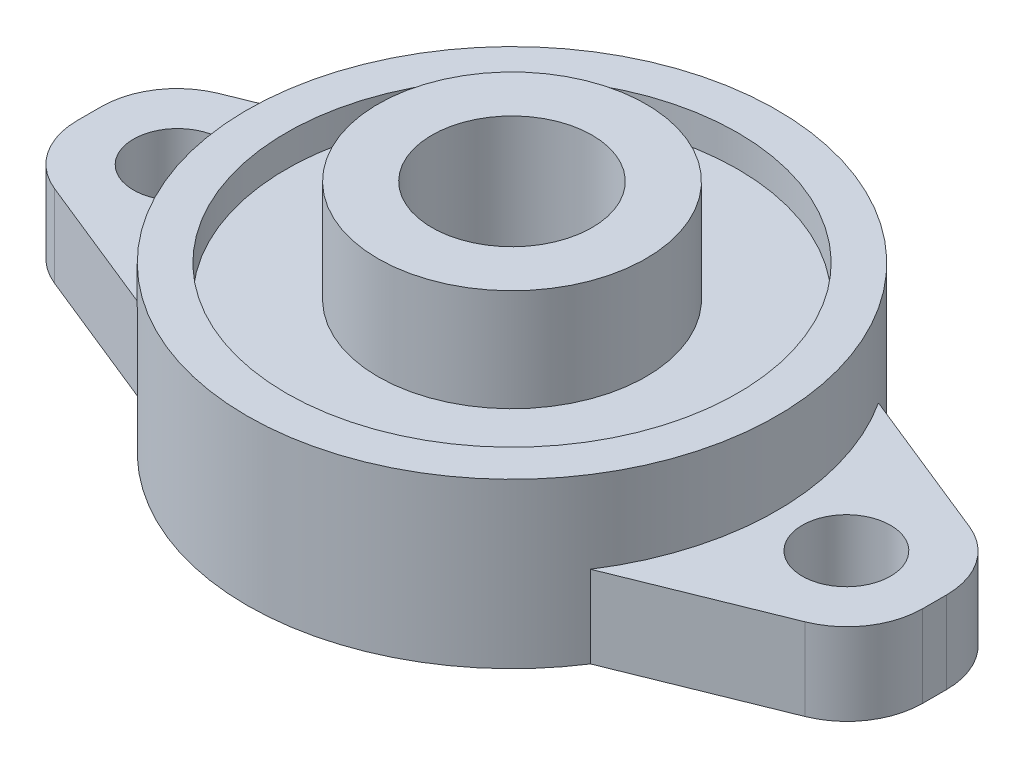
ISO-10303-21;
HEADER;
FILE_DESCRIPTION(('STEP AP214'),'2;1');
FILE_NAME('part.step','',(''),(''),'','','');
FILE_SCHEMA(('AUTOMOTIVE_DESIGN { 1 0 10303 214 1 1 1 1 }'));
ENDSEC;
DATA;
#1=APPLICATION_CONTEXT('core data for automotive mechanical design processes');
#2=APPLICATION_PROTOCOL_DEFINITION('international standard','automotive_design',2000,#1);
#3=PRODUCT_CONTEXT('',#1,'mechanical');
#4=PRODUCT('Part','Part','',(#3));
#5=PRODUCT_RELATED_PRODUCT_CATEGORY('part','',(#4));
#6=PRODUCT_DEFINITION_FORMATION('','',#4);
#7=PRODUCT_DEFINITION_CONTEXT('part definition',#1,'design');
#8=PRODUCT_DEFINITION('design','',#6,#7);
#9=PRODUCT_DEFINITION_SHAPE('','',#8);
#10=(LENGTH_UNIT() NAMED_UNIT(*) SI_UNIT(.MILLI.,.METRE.));
#11=(NAMED_UNIT(*) PLANE_ANGLE_UNIT() SI_UNIT($,.RADIAN.));
#12=(NAMED_UNIT(*) SI_UNIT($,.STERADIAN.) SOLID_ANGLE_UNIT());
#13=UNCERTAINTY_MEASURE_WITH_UNIT(LENGTH_MEASURE(1.E-05),#10,'distance_accuracy_value','');
#14=(GEOMETRIC_REPRESENTATION_CONTEXT(3) GLOBAL_UNCERTAINTY_ASSIGNED_CONTEXT((#13)) GLOBAL_UNIT_ASSIGNED_CONTEXT((#10,
#11,#12)) REPRESENTATION_CONTEXT('',''));
#15=CARTESIAN_POINT('',(0.,0.,0.));
#16=DIRECTION('',(0.,0.,1.));
#17=DIRECTION('',(1.,0.,0.));
#18=AXIS2_PLACEMENT_3D('',#15,#16,#17);
#19=CARTESIAN_POINT('',(0.,6.5,0.));
#20=DIRECTION('',(0.,1.,0.));
#21=DIRECTION('',(0.,0.,1.));
#22=AXIS2_PLACEMENT_3D('',#19,#20,#21);
#23=PLANE('',#22);
#24=DIRECTION('',(-0.927183854566787,0.,0.374606593415913));
#25=VECTOR('',#24,1.);
#26=CARTESIAN_POINT('',(6.43770427047511,6.5,15.9338772060349));
#27=LINE('',#26,#25);
#28=CARTESIAN_POINT('',(29.7476395604955,6.5,6.51605202634617));
#29=VERTEX_POINT('',#28);
#30=CARTESIAN_POINT('',(17.6293978961643,6.5,11.4121394697443));
#31=VERTEX_POINT('',#30);
#32=EDGE_CURVE('E123',#29,#31,#27,.T.);
#33=ORIENTED_EDGE('',*,*,#32,.F.);
#34=CARTESIAN_POINT('',(27.5,6.5,0.952948898945447));
#35=DIRECTION('',(0.,1.,0.));
#36=DIRECTION('',(0.,0.,1.));
#37=AXIS2_PLACEMENT_3D('',#34,#35,#36);
#38=CIRCLE('',#37,6.);
#39=CARTESIAN_POINT('',(33.5,6.5,0.952948898945447));
#40=VERTEX_POINT('',#39);
#41=EDGE_CURVE('E212',#29,#40,#38,.T.);
#42=ORIENTED_EDGE('',*,*,#41,.T.);
#43=DIRECTION('',(0.,0.,1.));
#44=VECTOR('',#43,1.);
#45=CARTESIAN_POINT('',(33.5,6.5,0.));
#46=LINE('',#45,#44);
#47=CARTESIAN_POINT('',(33.5,6.5,-0.952948898945441));
#48=VERTEX_POINT('',#47);
#49=EDGE_CURVE('E134',#48,#40,#46,.T.);
#50=ORIENTED_EDGE('',*,*,#49,.F.);
#51=CARTESIAN_POINT('',(27.5,6.5,-0.952948898945441));
#52=DIRECTION('',(0.,1.,0.));
#53=DIRECTION('',(0.,0.,1.));
#54=AXIS2_PLACEMENT_3D('',#51,#52,#53);
#55=CIRCLE('',#54,6.);
#56=CARTESIAN_POINT('',(29.7476395604955,6.5,-6.51605202634616));
#57=VERTEX_POINT('',#56);
#58=EDGE_CURVE('E211',#48,#57,#55,.T.);
#59=ORIENTED_EDGE('',*,*,#58,.T.);
#60=DIRECTION('',(-0.927183854566787,0.,-0.374606593415913));
#61=VECTOR('',#60,1.);
#62=CARTESIAN_POINT('',(6.43770427047513,6.5,-15.9338772060349));
#63=LINE('',#62,#61);
#64=CARTESIAN_POINT('',(17.6293978961643,6.5,-11.4121394697443));
#65=VERTEX_POINT('',#64);
#66=EDGE_CURVE('E152',#57,#65,#63,.T.);
#67=ORIENTED_EDGE('',*,*,#66,.T.);
#68=CARTESIAN_POINT('',(0.,6.5,0.));
#69=DIRECTION('',(0.,1.,0.));
#70=DIRECTION('',(0.,0.,1.));
#71=AXIS2_PLACEMENT_3D('',#68,#69,#70);
#72=CIRCLE('',#71,21.0007761156148);
#73=EDGE_CURVE('E143',#31,#65,#72,.T.);
#74=ORIENTED_EDGE('',*,*,#73,.F.);
#75=EDGE_LOOP('',(#33,#42,#50,#59,#67,#74));
#76=FACE_BOUND('',#75,.T.);
#77=CARTESIAN_POINT('',(26.5,6.5,0.));
#78=DIRECTION('',(0.,1.,0.));
#79=DIRECTION('',(0.,0.,1.));
#80=AXIS2_PLACEMENT_3D('',#77,#78,#79);
#81=CIRCLE('',#80,3.5);
#82=CARTESIAN_POINT('',(26.5,6.5,-3.5));
#83=VERTEX_POINT('',#82);
#84=EDGE_CURVE('E528',#83,#83,#81,.T.);
#85=ORIENTED_EDGE('',*,*,#84,.F.);
#86=EDGE_LOOP('',(#85));
#87=FACE_BOUND('',#86,.T.);
#88=ADVANCED_FACE('F34',(#76,#87),#23,.T.);
#89=CARTESIAN_POINT('',(-6.43770427047511,6.5,15.9338772060349));
#90=DIRECTION('',(0.374606593415913,0.,-0.927183854566787));
#91=DIRECTION('',(-0.927183854566787,0.,-0.374606593415913));
#92=AXIS2_PLACEMENT_3D('',#89,#90,#91);
#93=PLANE('',#92);
#94=DIRECTION('',(0.927183854566787,0.,0.374606593415913));
#95=VECTOR('',#94,1.);
#96=CARTESIAN_POINT('',(-6.43770427047511,6.5,15.9338772060349));
#97=LINE('',#96,#95);
#98=CARTESIAN_POINT('',(-29.7476395604955,6.5,6.51605202634617));
#99=VERTEX_POINT('',#98);
#100=CARTESIAN_POINT('',(-17.6293978961643,6.5,11.4121394697443));
#101=VERTEX_POINT('',#100);
#102=EDGE_CURVE('E135',#99,#101,#97,.T.);
#103=ORIENTED_EDGE('',*,*,#102,.F.);
#104=DIRECTION('',(0.,-1.,0.));
#105=VECTOR('',#104,1.);
#106=CARTESIAN_POINT('',(-29.7476395604955,0.,6.51605202634617));
#107=LINE('',#106,#105);
#108=CARTESIAN_POINT('',(-29.7476395604955,0.,6.51605202634617));
#109=VERTEX_POINT('',#108);
#110=EDGE_CURVE('E188',#99,#109,#107,.T.);
#111=ORIENTED_EDGE('',*,*,#110,.T.);
#112=DIRECTION('',(0.927183854566787,0.,0.374606593415913));
#113=VECTOR('',#112,1.);
#114=CARTESIAN_POINT('',(-6.43770427047511,0.,15.9338772060349));
#115=LINE('',#114,#113);
#116=CARTESIAN_POINT('',(-17.6293978961643,0.,11.4121394697443));
#117=VERTEX_POINT('',#116);
#118=EDGE_CURVE('E158',#109,#117,#115,.T.);
#119=ORIENTED_EDGE('',*,*,#118,.T.);
#120=DIRECTION('',(0.,-1.,0.));
#121=VECTOR('',#120,1.);
#122=CARTESIAN_POINT('',(-17.6293978961643,6.5,11.4121394697443));
#123=LINE('',#122,#121);
#124=EDGE_CURVE('E147',#101,#117,#123,.T.);
#125=ORIENTED_EDGE('',*,*,#124,.F.);
#126=EDGE_LOOP('',(#103,#111,#119,#125));
#127=FACE_BOUND('',#126,.T.);
#128=ADVANCED_FACE('F271',(#127),#93,.F.);
#129=CARTESIAN_POINT('',(6.43770427047511,6.5,15.9338772060349));
#130=DIRECTION('',(0.374606593415913,0.,0.927183854566787));
#131=DIRECTION('',(0.927183854566787,0.,-0.374606593415913));
#132=AXIS2_PLACEMENT_3D('',#129,#130,#131);
#133=PLANE('',#132);
#134=DIRECTION('',(-0.927183854566787,0.,0.374606593415913));
#135=VECTOR('',#134,1.);
#136=CARTESIAN_POINT('',(6.43770427047511,0.,15.9338772060349));
#137=LINE('',#136,#135);
#138=CARTESIAN_POINT('',(29.7476395604955,0.,6.51605202634617));
#139=VERTEX_POINT('',#138);
#140=CARTESIAN_POINT('',(17.6293978961643,0.,11.4121394697443));
#141=VERTEX_POINT('',#140);
#142=EDGE_CURVE('E235',#139,#141,#137,.T.);
#143=ORIENTED_EDGE('',*,*,#142,.F.);
#144=DIRECTION('',(0.,-1.,0.));
#145=VECTOR('',#144,1.);
#146=CARTESIAN_POINT('',(29.7476395604955,6.5,6.51605202634617));
#147=LINE('',#146,#145);
#148=EDGE_CURVE('E130',#139,#29,#147,.F.);
#149=ORIENTED_EDGE('',*,*,#148,.T.);
#150=ORIENTED_EDGE('',*,*,#32,.T.);
#151=DIRECTION('',(0.,-1.,0.));
#152=VECTOR('',#151,1.);
#153=CARTESIAN_POINT('',(17.6293978961643,6.5,11.4121394697443));
#154=LINE('',#153,#152);
#155=EDGE_CURVE('E127',#31,#141,#154,.T.);
#156=ORIENTED_EDGE('',*,*,#155,.T.);
#157=EDGE_LOOP('',(#143,#149,#150,#156));
#158=FACE_BOUND('',#157,.T.);
#159=ADVANCED_FACE('F126',(#158),#133,.T.);
#160=CARTESIAN_POINT('',(33.5,6.5,0.));
#161=DIRECTION('',(1.,0.,0.));
#162=DIRECTION('',(0.,0.,-1.));
#163=AXIS2_PLACEMENT_3D('',#160,#161,#162);
#164=PLANE('',#163);
#165=ORIENTED_EDGE('',*,*,#49,.T.);
#166=DIRECTION('',(0.,-1.,0.));
#167=VECTOR('',#166,1.);
#168=CARTESIAN_POINT('',(33.5,6.5,0.952948898945447));
#169=LINE('',#168,#167);
#170=CARTESIAN_POINT('',(33.5,0.,0.952948898945447));
#171=VERTEX_POINT('',#170);
#172=EDGE_CURVE('E344',#40,#171,#169,.T.);
#173=ORIENTED_EDGE('',*,*,#172,.T.);
#174=DIRECTION('',(0.,0.,1.));
#175=VECTOR('',#174,1.);
#176=CARTESIAN_POINT('',(33.5,0.,0.));
#177=LINE('',#176,#175);
#178=CARTESIAN_POINT('',(33.5,0.,-0.952948898945441));
#179=VERTEX_POINT('',#178);
#180=EDGE_CURVE('E231',#179,#171,#177,.T.);
#181=ORIENTED_EDGE('',*,*,#180,.F.);
#182=DIRECTION('',(0.,-1.,0.));
#183=VECTOR('',#182,1.);
#184=CARTESIAN_POINT('',(33.5,6.5,-0.952948898945441));
#185=LINE('',#184,#183);
#186=EDGE_CURVE('E350',#179,#48,#185,.F.);
#187=ORIENTED_EDGE('',*,*,#186,.T.);
#188=EDGE_LOOP('',(#165,#173,#181,#187));
#189=FACE_BOUND('',#188,.T.);
#190=ADVANCED_FACE('F304',(#189),#164,.T.);
#191=CARTESIAN_POINT('',(6.43770427047513,6.5,-15.9338772060349));
#192=DIRECTION('',(-0.374606593415913,0.,0.927183854566787));
#193=DIRECTION('',(0.927183854566787,0.,0.374606593415913));
#194=AXIS2_PLACEMENT_3D('',#191,#192,#193);
#195=PLANE('',#194);
#196=ORIENTED_EDGE('',*,*,#66,.F.);
#197=DIRECTION('',(0.,-1.,0.));
#198=VECTOR('',#197,1.);
#199=CARTESIAN_POINT('',(29.7476395604955,0.,-6.51605202634616));
#200=LINE('',#199,#198);
#201=CARTESIAN_POINT('',(29.7476395604955,0.,-6.51605202634616));
#202=VERTEX_POINT('',#201);
#203=EDGE_CURVE('E186',#57,#202,#200,.T.);
#204=ORIENTED_EDGE('',*,*,#203,.T.);
#205=DIRECTION('',(-0.927183854566787,0.,-0.374606593415913));
#206=VECTOR('',#205,1.);
#207=CARTESIAN_POINT('',(6.43770427047513,0.,-15.9338772060349));
#208=LINE('',#207,#206);
#209=CARTESIAN_POINT('',(17.6293978961643,0.,-11.4121394697443));
#210=VERTEX_POINT('',#209);
#211=EDGE_CURVE('E220',#202,#210,#208,.T.);
#212=ORIENTED_EDGE('',*,*,#211,.T.);
#213=DIRECTION('',(0.,-1.,0.));
#214=VECTOR('',#213,1.);
#215=CARTESIAN_POINT('',(17.6293978961643,6.5,-11.4121394697443));
#216=LINE('',#215,#214);
#217=EDGE_CURVE('E148',#65,#210,#216,.T.);
#218=ORIENTED_EDGE('',*,*,#217,.F.);
#219=EDGE_LOOP('',(#196,#204,#212,#218));
#220=FACE_BOUND('',#219,.T.);
#221=ADVANCED_FACE('F219',(#220),#195,.F.);
#222=CARTESIAN_POINT('',(0.,6.5,0.));
#223=DIRECTION('',(0.,-1.,0.));
#224=DIRECTION('',(0.,0.,-1.));
#225=AXIS2_PLACEMENT_3D('',#222,#223,#224);
#226=CYLINDRICAL_SURFACE('',#225,21.0007761156148);
#227=CARTESIAN_POINT('',(0.,0.,0.));
#228=DIRECTION('',(0.,1.,0.));
#229=DIRECTION('',(0.,0.,1.));
#230=AXIS2_PLACEMENT_3D('',#227,#228,#229);
#231=CIRCLE('',#230,21.0007761156148);
#232=CARTESIAN_POINT('',(-17.6293978961643,0.,-11.4121394697443));
#233=VERTEX_POINT('',#232);
#234=EDGE_CURVE('E230',#210,#233,#231,.T.);
#235=ORIENTED_EDGE('',*,*,#234,.T.);
#236=DIRECTION('',(0.,-1.,0.));
#237=VECTOR('',#236,1.);
#238=CARTESIAN_POINT('',(-17.6293978961643,6.5,-11.4121394697443));
#239=LINE('',#238,#237);
#240=CARTESIAN_POINT('',(-17.6293978961643,6.5,-11.4121394697443));
#241=VERTEX_POINT('',#240);
#242=EDGE_CURVE('E336',#241,#233,#239,.T.);
#243=ORIENTED_EDGE('',*,*,#242,.F.);
#244=EDGE_CURVE('E174',#241,#101,#72,.T.);
#245=ORIENTED_EDGE('',*,*,#244,.T.);
#246=ORIENTED_EDGE('',*,*,#124,.T.);
#247=EDGE_CURVE('E146',#117,#141,#231,.T.);
#248=ORIENTED_EDGE('',*,*,#247,.T.);
#249=ORIENTED_EDGE('',*,*,#155,.F.);
#250=ORIENTED_EDGE('',*,*,#73,.T.);
#251=ORIENTED_EDGE('',*,*,#217,.T.);
#252=EDGE_LOOP('',(#235,#243,#245,#246,#248,#249,#250,#251));
#253=FACE_BOUND('',#252,.T.);
#254=CARTESIAN_POINT('',(0.,13.,0.));
#255=DIRECTION('',(0.,1.,0.));
#256=DIRECTION('',(0.,0.,1.));
#257=AXIS2_PLACEMENT_3D('',#254,#255,#256);
#258=CIRCLE('',#257,21.0007761156148);
#259=CARTESIAN_POINT('',(0.,13.,21.0007761156148));
#260=VERTEX_POINT('',#259);
#261=EDGE_CURVE('E154',#260,#260,#258,.T.);
#262=ORIENTED_EDGE('',*,*,#261,.F.);
#263=EDGE_LOOP('',(#262));
#264=FACE_BOUND('',#263,.T.);
#265=ADVANCED_FACE('F140',(#253,#264),#226,.T.);
#266=CARTESIAN_POINT('',(-6.43770427047513,6.5,-15.9338772060349));
#267=DIRECTION('',(-0.374606593415913,0.,-0.927183854566787));
#268=DIRECTION('',(-0.927183854566787,0.,0.374606593415913));
#269=AXIS2_PLACEMENT_3D('',#266,#267,#268);
#270=PLANE('',#269);
#271=DIRECTION('',(0.927183854566787,0.,-0.374606593415913));
#272=VECTOR('',#271,1.);
#273=CARTESIAN_POINT('',(-6.43770427047513,0.,-15.9338772060349));
#274=LINE('',#273,#272);
#275=CARTESIAN_POINT('',(-29.7476395604955,0.,-6.51605202634616));
#276=VERTEX_POINT('',#275);
#277=EDGE_CURVE('E233',#276,#233,#274,.T.);
#278=ORIENTED_EDGE('',*,*,#277,.F.);
#279=DIRECTION('',(0.,-1.,0.));
#280=VECTOR('',#279,1.);
#281=CARTESIAN_POINT('',(-29.7476395604955,6.5,-6.51605202634616));
#282=LINE('',#281,#280);
#283=CARTESIAN_POINT('',(-29.7476395604955,6.5,-6.51605202634616));
#284=VERTEX_POINT('',#283);
#285=EDGE_CURVE('E11',#276,#284,#282,.F.);
#286=ORIENTED_EDGE('',*,*,#285,.T.);
#287=DIRECTION('',(0.927183854566787,0.,-0.374606593415913));
#288=VECTOR('',#287,1.);
#289=CARTESIAN_POINT('',(-6.43770427047513,6.5,-15.9338772060349));
#290=LINE('',#289,#288);
#291=EDGE_CURVE('E196',#284,#241,#290,.T.);
#292=ORIENTED_EDGE('',*,*,#291,.T.);
#293=ORIENTED_EDGE('',*,*,#242,.T.);
#294=EDGE_LOOP('',(#278,#286,#292,#293));
#295=FACE_BOUND('',#294,.T.);
#296=ADVANCED_FACE('F296',(#295),#270,.T.);
#297=CARTESIAN_POINT('',(0.,6.5,0.));
#298=DIRECTION('',(0.,-1.,0.));
#299=DIRECTION('',(0.,0.,-1.));
#300=AXIS2_PLACEMENT_3D('',#297,#298,#299);
#301=CYLINDRICAL_SURFACE('',#300,6.35);
#302=CARTESIAN_POINT('',(0.,0.,0.));
#303=DIRECTION('',(0.,1.,0.));
#304=DIRECTION('',(0.,0.,1.));
#305=AXIS2_PLACEMENT_3D('',#302,#303,#304);
#306=CIRCLE('',#305,6.35);
#307=CARTESIAN_POINT('',(0.,0.,-6.35));
#308=VERTEX_POINT('',#307);
#309=EDGE_CURVE('E245',#308,#308,#306,.T.);
#310=CARTESIAN_POINT('',(0.,18.6,0.));
#311=DIRECTION('',(0.,1.,0.));
#312=DIRECTION('',(0.,0.,1.));
#313=AXIS2_PLACEMENT_3D('',#310,#311,#312);
#314=CIRCLE('',#313,6.35);
#315=CARTESIAN_POINT('',(0.,18.6,-6.35));
#316=VERTEX_POINT('',#315);
#317=EDGE_CURVE('E365',#316,#316,#314,.T.);
#318=CARTESIAN_POINT('',(0.,0.,-6.35));
#319=CARTESIAN_POINT('',(0.,0.19375,-6.35));
#320=CARTESIAN_POINT('',(0.,0.3875,-6.35));
#321=CARTESIAN_POINT('',(0.,0.775,-6.35));
#322=CARTESIAN_POINT('',(0.,0.96875,-6.35));
#323=CARTESIAN_POINT('',(0.,1.35625,-6.35));
#324=CARTESIAN_POINT('',(0.,1.55,-6.35));
#325=CARTESIAN_POINT('',(0.,1.9375,-6.35));
#326=CARTESIAN_POINT('',(0.,2.13125,-6.35));
#327=CARTESIAN_POINT('',(0.,2.51875,-6.35));
#328=CARTESIAN_POINT('',(0.,2.7125,-6.35));
#329=CARTESIAN_POINT('',(0.,3.1,-6.35));
#330=CARTESIAN_POINT('',(0.,3.29375,-6.35));
#331=CARTESIAN_POINT('',(0.,3.68125,-6.35));
#332=CARTESIAN_POINT('',(0.,3.875,-6.35));
#333=CARTESIAN_POINT('',(0.,4.2625,-6.35));
#334=CARTESIAN_POINT('',(0.,4.45625,-6.35));
#335=CARTESIAN_POINT('',(0.,4.84375,-6.35));
#336=CARTESIAN_POINT('',(0.,5.0375,-6.35));
#337=CARTESIAN_POINT('',(0.,5.425,-6.35));
#338=CARTESIAN_POINT('',(0.,5.61875,-6.35));
#339=CARTESIAN_POINT('',(0.,6.00625,-6.35));
#340=CARTESIAN_POINT('',(0.,6.2,-6.35));
#341=CARTESIAN_POINT('',(0.,6.5875,-6.35));
#342=CARTESIAN_POINT('',(0.,6.78125,-6.35));
#343=CARTESIAN_POINT('',(0.,7.16875,-6.35));
#344=CARTESIAN_POINT('',(0.,7.3625,-6.35));
#345=CARTESIAN_POINT('',(0.,7.75,-6.35));
#346=CARTESIAN_POINT('',(0.,7.94375,-6.35));
#347=CARTESIAN_POINT('',(0.,8.33125,-6.35));
#348=CARTESIAN_POINT('',(0.,8.525,-6.35));
#349=CARTESIAN_POINT('',(0.,8.9125,-6.35));
#350=CARTESIAN_POINT('',(0.,9.10625,-6.35));
#351=CARTESIAN_POINT('',(0.,9.49375,-6.35));
#352=CARTESIAN_POINT('',(0.,9.6875,-6.35));
#353=CARTESIAN_POINT('',(0.,10.075,-6.35));
#354=CARTESIAN_POINT('',(0.,10.26875,-6.35));
#355=CARTESIAN_POINT('',(0.,10.65625,-6.35));
#356=CARTESIAN_POINT('',(0.,10.85,-6.35));
#357=CARTESIAN_POINT('',(0.,11.2375,-6.35));
#358=CARTESIAN_POINT('',(0.,11.43125,-6.35));
#359=CARTESIAN_POINT('',(0.,11.81875,-6.35));
#360=CARTESIAN_POINT('',(0.,12.0125,-6.35));
#361=CARTESIAN_POINT('',(0.,12.4,-6.35));
#362=CARTESIAN_POINT('',(0.,12.59375,-6.35));
#363=CARTESIAN_POINT('',(0.,12.98125,-6.35));
#364=CARTESIAN_POINT('',(0.,13.175,-6.35));
#365=CARTESIAN_POINT('',(0.,13.5625,-6.35));
#366=CARTESIAN_POINT('',(0.,13.75625,-6.35));
#367=CARTESIAN_POINT('',(0.,14.14375,-6.35));
#368=CARTESIAN_POINT('',(0.,14.3375,-6.35));
#369=CARTESIAN_POINT('',(0.,14.725,-6.35));
#370=CARTESIAN_POINT('',(0.,14.91875,-6.35));
#371=CARTESIAN_POINT('',(0.,15.30625,-6.35));
#372=CARTESIAN_POINT('',(0.,15.5,-6.35));
#373=CARTESIAN_POINT('',(0.,15.8875,-6.35));
#374=CARTESIAN_POINT('',(0.,16.08125,-6.35));
#375=CARTESIAN_POINT('',(0.,16.46875,-6.35));
#376=CARTESIAN_POINT('',(0.,16.6625,-6.35));
#377=CARTESIAN_POINT('',(0.,17.05,-6.35));
#378=CARTESIAN_POINT('',(0.,17.24375,-6.35));
#379=CARTESIAN_POINT('',(0.,17.63125,-6.35));
#380=CARTESIAN_POINT('',(0.,17.825,-6.35));
#381=CARTESIAN_POINT('',(0.,18.2125,-6.35));
#382=CARTESIAN_POINT('',(0.,18.40625,-6.35));
#383=CARTESIAN_POINT('',(0.,18.6,-6.35));
#384=B_SPLINE_CURVE_WITH_KNOTS('',3,(#318,#319,#320,#321,#322,#323,#324,#325,#326,#327,#328,
#329,#330,#331,#332,#333,#334,#335,#336,#337,#338,#339,#340,#341,#342,#343,#344,#345,#346,#347,
#348,#349,#350,#351,#352,#353,#354,#355,#356,#357,#358,#359,#360,#361,#362,#363,#364,#365,#366,
#367,#368,#369,#370,#371,#372,#373,#374,#375,#376,#377,#378,#379,#380,#381,#382,#383),
.UNSPECIFIED.,.F.,.F.,(4,2,2,2,2,2,2,2,2,2,2,2,2,2,2,2,2,2,2,2,2,2,2,2,2,2,2,2,2,2,2,2,4),(0.,
0.58125,1.1625,1.74375,2.325,2.90625,3.4875,4.06875,4.65,5.23125,5.8125,6.39375,6.975,7.55625,
8.1375,8.71875,9.3,9.88125,10.4625,11.04375,11.625,12.20625,12.7875,13.36875,13.95,14.53125,
15.1125,15.69375,16.275,16.85625,17.4375,18.01875,18.6),.UNSPECIFIED.);
#385=EDGE_CURVE('BSEAM302',#308,#316,#384,.T.);
#386=ORIENTED_EDGE('',*,*,#309,.F.);
#387=ORIENTED_EDGE('',*,*,#317,.T.);
#388=ORIENTED_EDGE('',*,*,#385,.T.);
#389=ORIENTED_EDGE('',*,*,#385,.F.);
#390=EDGE_LOOP('',(#386,#388,#387,#389));
#391=FACE_BOUND('',#390,.T.);
#392=ADVANCED_FACE('F302',(#391),#301,.F.);
#393=CARTESIAN_POINT('',(-26.5,6.5,0.));
#394=DIRECTION('',(0.,-1.,0.));
#395=DIRECTION('',(0.,0.,-1.));
#396=AXIS2_PLACEMENT_3D('',#393,#394,#395);
#397=CYLINDRICAL_SURFACE('',#396,3.5);
#398=CARTESIAN_POINT('',(-26.5,6.5,0.));
#399=DIRECTION('',(0.,1.,0.));
#400=DIRECTION('',(0.,0.,1.));
#401=AXIS2_PLACEMENT_3D('',#398,#399,#400);
#402=CIRCLE('',#401,3.5);
#403=CARTESIAN_POINT('',(-26.5,6.5,-3.5));
#404=VERTEX_POINT('',#403);
#405=EDGE_CURVE('E526',#404,#404,#402,.T.);
#406=CARTESIAN_POINT('',(-26.5,0.,0.));
#407=DIRECTION('',(0.,1.,0.));
#408=DIRECTION('',(0.,0.,1.));
#409=AXIS2_PLACEMENT_3D('',#406,#407,#408);
#410=CIRCLE('',#409,3.5);
#411=CARTESIAN_POINT('',(-26.5,0.,-3.5));
#412=VERTEX_POINT('',#411);
#413=EDGE_CURVE('E243',#412,#412,#410,.T.);
#414=CARTESIAN_POINT('',(-26.5,6.5,-3.5));
#415=CARTESIAN_POINT('',(-26.5,6.43229166666667,-3.5));
#416=CARTESIAN_POINT('',(-26.5,6.36458333333333,-3.5));
#417=CARTESIAN_POINT('',(-26.5,6.22916666666667,-3.5));
#418=CARTESIAN_POINT('',(-26.5,6.16145833333333,-3.5));
#419=CARTESIAN_POINT('',(-26.5,6.02604166666667,-3.5));
#420=CARTESIAN_POINT('',(-26.5,5.95833333333333,-3.5));
#421=CARTESIAN_POINT('',(-26.5,5.82291666666667,-3.5));
#422=CARTESIAN_POINT('',(-26.5,5.75520833333333,-3.5));
#423=CARTESIAN_POINT('',(-26.5,5.61979166666667,-3.5));
#424=CARTESIAN_POINT('',(-26.5,5.55208333333333,-3.5));
#425=CARTESIAN_POINT('',(-26.5,5.41666666666667,-3.5));
#426=CARTESIAN_POINT('',(-26.5,5.34895833333333,-3.5));
#427=CARTESIAN_POINT('',(-26.5,5.21354166666667,-3.5));
#428=CARTESIAN_POINT('',(-26.5,5.14583333333333,-3.5));
#429=CARTESIAN_POINT('',(-26.5,5.01041666666667,-3.5));
#430=CARTESIAN_POINT('',(-26.5,4.94270833333333,-3.5));
#431=CARTESIAN_POINT('',(-26.5,4.80729166666667,-3.5));
#432=CARTESIAN_POINT('',(-26.5,4.73958333333333,-3.5));
#433=CARTESIAN_POINT('',(-26.5,4.60416666666667,-3.5));
#434=CARTESIAN_POINT('',(-26.5,4.53645833333333,-3.5));
#435=CARTESIAN_POINT('',(-26.5,4.40104166666667,-3.5));
#436=CARTESIAN_POINT('',(-26.5,4.33333333333333,-3.5));
#437=CARTESIAN_POINT('',(-26.5,4.19791666666667,-3.5));
#438=CARTESIAN_POINT('',(-26.5,4.13020833333333,-3.5));
#439=CARTESIAN_POINT('',(-26.5,3.99479166666667,-3.5));
#440=CARTESIAN_POINT('',(-26.5,3.92708333333333,-3.5));
#441=CARTESIAN_POINT('',(-26.5,3.79166666666667,-3.5));
#442=CARTESIAN_POINT('',(-26.5,3.72395833333333,-3.5));
#443=CARTESIAN_POINT('',(-26.5,3.58854166666667,-3.5));
#444=CARTESIAN_POINT('',(-26.5,3.52083333333333,-3.5));
#445=CARTESIAN_POINT('',(-26.5,3.38541666666667,-3.5));
#446=CARTESIAN_POINT('',(-26.5,3.31770833333333,-3.5));
#447=CARTESIAN_POINT('',(-26.5,3.18229166666667,-3.5));
#448=CARTESIAN_POINT('',(-26.5,3.11458333333333,-3.5));
#449=CARTESIAN_POINT('',(-26.5,2.97916666666667,-3.5));
#450=CARTESIAN_POINT('',(-26.5,2.91145833333333,-3.5));
#451=CARTESIAN_POINT('',(-26.5,2.77604166666667,-3.5));
#452=CARTESIAN_POINT('',(-26.5,2.70833333333333,-3.5));
#453=CARTESIAN_POINT('',(-26.5,2.57291666666667,-3.5));
#454=CARTESIAN_POINT('',(-26.5,2.50520833333333,-3.5));
#455=CARTESIAN_POINT('',(-26.5,2.36979166666667,-3.5));
#456=CARTESIAN_POINT('',(-26.5,2.30208333333333,-3.5));
#457=CARTESIAN_POINT('',(-26.5,2.16666666666667,-3.5));
#458=CARTESIAN_POINT('',(-26.5,2.09895833333333,-3.5));
#459=CARTESIAN_POINT('',(-26.5,1.96354166666667,-3.5));
#460=CARTESIAN_POINT('',(-26.5,1.89583333333333,-3.5));
#461=CARTESIAN_POINT('',(-26.5,1.76041666666667,-3.5));
#462=CARTESIAN_POINT('',(-26.5,1.69270833333333,-3.5));
#463=CARTESIAN_POINT('',(-26.5,1.55729166666667,-3.5));
#464=CARTESIAN_POINT('',(-26.5,1.48958333333333,-3.5));
#465=CARTESIAN_POINT('',(-26.5,1.35416666666667,-3.5));
#466=CARTESIAN_POINT('',(-26.5,1.28645833333333,-3.5));
#467=CARTESIAN_POINT('',(-26.5,1.15104166666667,-3.5));
#468=CARTESIAN_POINT('',(-26.5,1.08333333333333,-3.5));
#469=CARTESIAN_POINT('',(-26.5,0.947916666666667,-3.5));
#470=CARTESIAN_POINT('',(-26.5,0.880208333333333,-3.5));
#471=CARTESIAN_POINT('',(-26.5,0.744791666666667,-3.5));
#472=CARTESIAN_POINT('',(-26.5,0.677083333333333,-3.5));
#473=CARTESIAN_POINT('',(-26.5,0.541666666666667,-3.5));
#474=CARTESIAN_POINT('',(-26.5,0.473958333333333,-3.5));
#475=CARTESIAN_POINT('',(-26.5,0.338541666666667,-3.5));
#476=CARTESIAN_POINT('',(-26.5,0.270833333333334,-3.5));
#477=CARTESIAN_POINT('',(-26.5,0.135416666666667,-3.5));
#478=CARTESIAN_POINT('',(-26.5,0.0677083333333334,-3.5));
#479=CARTESIAN_POINT('',(-26.5,0.,-3.5));
#480=B_SPLINE_CURVE_WITH_KNOTS('',3,(#414,#415,#416,#417,#418,#419,#420,#421,#422,#423,#424,
#425,#426,#427,#428,#429,#430,#431,#432,#433,#434,#435,#436,#437,#438,#439,#440,#441,#442,#443,
#444,#445,#446,#447,#448,#449,#450,#451,#452,#453,#454,#455,#456,#457,#458,#459,#460,#461,#462,
#463,#464,#465,#466,#467,#468,#469,#470,#471,#472,#473,#474,#475,#476,#477,#478,#479),
.UNSPECIFIED.,.F.,.F.,(4,2,2,2,2,2,2,2,2,2,2,2,2,2,2,2,2,2,2,2,2,2,2,2,2,2,2,2,2,2,2,2,4),(0.,
0.203124999999999,0.40625,0.609375,0.812499999999999,1.015625,1.21875,1.421875,1.625,1.828125,
2.03125,2.234375,2.4375,2.640625,2.84375,3.046875,3.25,3.453125,3.65625,3.859375,4.0625,
4.265625,4.46875,4.671875,4.875,5.078125,5.28125,5.484375,5.6875,5.890625,6.09375,6.296875,6.5),.UNSPECIFIED.);
#481=EDGE_CURVE('BSEAM264',#404,#412,#480,.T.);
#482=ORIENTED_EDGE('',*,*,#405,.T.);
#483=ORIENTED_EDGE('',*,*,#413,.F.);
#484=ORIENTED_EDGE('',*,*,#481,.T.);
#485=ORIENTED_EDGE('',*,*,#481,.F.);
#486=EDGE_LOOP('',(#482,#484,#483,#485));
#487=FACE_BOUND('',#486,.T.);
#488=ADVANCED_FACE('F264',(#487),#397,.F.);
#489=CARTESIAN_POINT('',(-33.5,6.5,0.));
#490=DIRECTION('',(-1.,0.,0.));
#491=DIRECTION('',(0.,0.,1.));
#492=AXIS2_PLACEMENT_3D('',#489,#490,#491);
#493=PLANE('',#492);
#494=DIRECTION('',(0.,0.,-1.));
#495=VECTOR('',#494,1.);
#496=CARTESIAN_POINT('',(-33.5,0.,0.));
#497=LINE('',#496,#495);
#498=CARTESIAN_POINT('',(-33.5,0.,0.952948898945446));
#499=VERTEX_POINT('',#498);
#500=CARTESIAN_POINT('',(-33.5,0.,-0.95294889894544));
#501=VERTEX_POINT('',#500);
#502=EDGE_CURVE('E240',#499,#501,#497,.T.);
#503=ORIENTED_EDGE('',*,*,#502,.F.);
#504=DIRECTION('',(0.,-1.,0.));
#505=VECTOR('',#504,1.);
#506=CARTESIAN_POINT('',(-33.5,6.5,0.952948898945446));
#507=LINE('',#506,#505);
#508=CARTESIAN_POINT('',(-33.5,6.5,0.952948898945446));
#509=VERTEX_POINT('',#508);
#510=EDGE_CURVE('E194',#499,#509,#507,.F.);
#511=ORIENTED_EDGE('',*,*,#510,.T.);
#512=DIRECTION('',(0.,0.,-1.));
#513=VECTOR('',#512,1.);
#514=CARTESIAN_POINT('',(-33.5,6.5,0.));
#515=LINE('',#514,#513);
#516=CARTESIAN_POINT('',(-33.5,6.5,-0.95294889894544));
#517=VERTEX_POINT('',#516);
#518=EDGE_CURVE('E199',#509,#517,#515,.T.);
#519=ORIENTED_EDGE('',*,*,#518,.T.);
#520=DIRECTION('',(0.,-1.,0.));
#521=VECTOR('',#520,1.);
#522=CARTESIAN_POINT('',(-33.5,6.5,-0.95294889894544));
#523=LINE('',#522,#521);
#524=EDGE_CURVE('E191',#517,#501,#523,.T.);
#525=ORIENTED_EDGE('',*,*,#524,.T.);
#526=EDGE_LOOP('',(#503,#511,#519,#525));
#527=FACE_BOUND('',#526,.T.);
#528=ADVANCED_FACE('F256',(#527),#493,.T.);
#529=CARTESIAN_POINT('',(26.5,6.5,0.));
#530=DIRECTION('',(0.,-1.,0.));
#531=DIRECTION('',(0.,0.,-1.));
#532=AXIS2_PLACEMENT_3D('',#529,#530,#531);
#533=CYLINDRICAL_SURFACE('',#532,3.5);
#534=CARTESIAN_POINT('',(26.5,0.,0.));
#535=DIRECTION('',(0.,1.,0.));
#536=DIRECTION('',(0.,0.,1.));
#537=AXIS2_PLACEMENT_3D('',#534,#535,#536);
#538=CIRCLE('',#537,3.5);
#539=CARTESIAN_POINT('',(26.5,0.,-3.5));
#540=VERTEX_POINT('',#539);
#541=EDGE_CURVE('E169',#540,#540,#538,.T.);
#542=CARTESIAN_POINT('',(26.5,6.5,-3.5));
#543=CARTESIAN_POINT('',(26.5,6.43229166666667,-3.5));
#544=CARTESIAN_POINT('',(26.5,6.36458333333333,-3.5));
#545=CARTESIAN_POINT('',(26.5,6.22916666666667,-3.5));
#546=CARTESIAN_POINT('',(26.5,6.16145833333333,-3.5));
#547=CARTESIAN_POINT('',(26.5,6.02604166666667,-3.5));
#548=CARTESIAN_POINT('',(26.5,5.95833333333333,-3.5));
#549=CARTESIAN_POINT('',(26.5,5.82291666666667,-3.5));
#550=CARTESIAN_POINT('',(26.5,5.75520833333333,-3.5));
#551=CARTESIAN_POINT('',(26.5,5.61979166666667,-3.5));
#552=CARTESIAN_POINT('',(26.5,5.55208333333333,-3.5));
#553=CARTESIAN_POINT('',(26.5,5.41666666666667,-3.5));
#554=CARTESIAN_POINT('',(26.5,5.34895833333333,-3.5));
#555=CARTESIAN_POINT('',(26.5,5.21354166666667,-3.5));
#556=CARTESIAN_POINT('',(26.5,5.14583333333333,-3.5));
#557=CARTESIAN_POINT('',(26.5,5.01041666666667,-3.5));
#558=CARTESIAN_POINT('',(26.5,4.94270833333333,-3.5));
#559=CARTESIAN_POINT('',(26.5,4.80729166666667,-3.5));
#560=CARTESIAN_POINT('',(26.5,4.73958333333333,-3.5));
#561=CARTESIAN_POINT('',(26.5,4.60416666666667,-3.5));
#562=CARTESIAN_POINT('',(26.5,4.53645833333333,-3.5));
#563=CARTESIAN_POINT('',(26.5,4.40104166666667,-3.5));
#564=CARTESIAN_POINT('',(26.5,4.33333333333333,-3.5));
#565=CARTESIAN_POINT('',(26.5,4.19791666666667,-3.5));
#566=CARTESIAN_POINT('',(26.5,4.13020833333333,-3.5));
#567=CARTESIAN_POINT('',(26.5,3.99479166666667,-3.5));
#568=CARTESIAN_POINT('',(26.5,3.92708333333333,-3.5));
#569=CARTESIAN_POINT('',(26.5,3.79166666666667,-3.5));
#570=CARTESIAN_POINT('',(26.5,3.72395833333333,-3.5));
#571=CARTESIAN_POINT('',(26.5,3.58854166666667,-3.5));
#572=CARTESIAN_POINT('',(26.5,3.52083333333333,-3.5));
#573=CARTESIAN_POINT('',(26.5,3.38541666666667,-3.5));
#574=CARTESIAN_POINT('',(26.5,3.31770833333333,-3.5));
#575=CARTESIAN_POINT('',(26.5,3.18229166666667,-3.5));
#576=CARTESIAN_POINT('',(26.5,3.11458333333333,-3.5));
#577=CARTESIAN_POINT('',(26.5,2.97916666666667,-3.5));
#578=CARTESIAN_POINT('',(26.5,2.91145833333333,-3.5));
#579=CARTESIAN_POINT('',(26.5,2.77604166666667,-3.5));
#580=CARTESIAN_POINT('',(26.5,2.70833333333333,-3.5));
#581=CARTESIAN_POINT('',(26.5,2.57291666666667,-3.5));
#582=CARTESIAN_POINT('',(26.5,2.50520833333333,-3.5));
#583=CARTESIAN_POINT('',(26.5,2.36979166666667,-3.5));
#584=CARTESIAN_POINT('',(26.5,2.30208333333333,-3.5));
#585=CARTESIAN_POINT('',(26.5,2.16666666666667,-3.5));
#586=CARTESIAN_POINT('',(26.5,2.09895833333333,-3.5));
#587=CARTESIAN_POINT('',(26.5,1.96354166666667,-3.5));
#588=CARTESIAN_POINT('',(26.5,1.89583333333333,-3.5));
#589=CARTESIAN_POINT('',(26.5,1.76041666666667,-3.5));
#590=CARTESIAN_POINT('',(26.5,1.69270833333333,-3.5));
#591=CARTESIAN_POINT('',(26.5,1.55729166666667,-3.5));
#592=CARTESIAN_POINT('',(26.5,1.48958333333333,-3.5));
#593=CARTESIAN_POINT('',(26.5,1.35416666666667,-3.5));
#594=CARTESIAN_POINT('',(26.5,1.28645833333333,-3.5));
#595=CARTESIAN_POINT('',(26.5,1.15104166666667,-3.5));
#596=CARTESIAN_POINT('',(26.5,1.08333333333333,-3.5));
#597=CARTESIAN_POINT('',(26.5,0.947916666666667,-3.5));
#598=CARTESIAN_POINT('',(26.5,0.880208333333333,-3.5));
#599=CARTESIAN_POINT('',(26.5,0.744791666666667,-3.5));
#600=CARTESIAN_POINT('',(26.5,0.677083333333333,-3.5));
#601=CARTESIAN_POINT('',(26.5,0.541666666666667,-3.5));
#602=CARTESIAN_POINT('',(26.5,0.473958333333333,-3.5));
#603=CARTESIAN_POINT('',(26.5,0.338541666666667,-3.5));
#604=CARTESIAN_POINT('',(26.5,0.270833333333334,-3.5));
#605=CARTESIAN_POINT('',(26.5,0.135416666666667,-3.5));
#606=CARTESIAN_POINT('',(26.5,0.0677083333333334,-3.5));
#607=CARTESIAN_POINT('',(26.5,0.,-3.5));
#608=B_SPLINE_CURVE_WITH_KNOTS('',3,(#542,#543,#544,#545,#546,#547,#548,#549,#550,#551,#552,
#553,#554,#555,#556,#557,#558,#559,#560,#561,#562,#563,#564,#565,#566,#567,#568,#569,#570,#571,
#572,#573,#574,#575,#576,#577,#578,#579,#580,#581,#582,#583,#584,#585,#586,#587,#588,#589,#590,
#591,#592,#593,#594,#595,#596,#597,#598,#599,#600,#601,#602,#603,#604,#605,#606,#607),
.UNSPECIFIED.,.F.,.F.,(4,2,2,2,2,2,2,2,2,2,2,2,2,2,2,2,2,2,2,2,2,2,2,2,2,2,2,2,2,2,2,2,4),(0.,
0.203124999999999,0.40625,0.609375,0.812499999999999,1.015625,1.21875,1.421875,1.625,1.828125,
2.03125,2.234375,2.4375,2.640625,2.84375,3.046875,3.25,3.453125,3.65625,3.859375,4.0625,
4.265625,4.46875,4.671875,4.875,5.078125,5.28125,5.484375,5.6875,5.890625,6.09375,6.296875,6.5),.UNSPECIFIED.);
#609=EDGE_CURVE('BSEAM253',#83,#540,#608,.T.);
#610=ORIENTED_EDGE('',*,*,#84,.T.);
#611=ORIENTED_EDGE('',*,*,#541,.F.);
#612=ORIENTED_EDGE('',*,*,#609,.T.);
#613=ORIENTED_EDGE('',*,*,#609,.F.);
#614=EDGE_LOOP('',(#610,#612,#611,#613));
#615=FACE_BOUND('',#614,.T.);
#616=ADVANCED_FACE('F253',(#615),#533,.F.);
#617=ORIENTED_EDGE('',*,*,#518,.F.);
#618=CARTESIAN_POINT('',(-27.5,6.5,0.952948898945446));
#619=DIRECTION('',(0.,1.,0.));
#620=DIRECTION('',(0.,0.,1.));
#621=AXIS2_PLACEMENT_3D('',#618,#619,#620);
#622=CIRCLE('',#621,6.);
#623=EDGE_CURVE('E42',#509,#99,#622,.T.);
#624=ORIENTED_EDGE('',*,*,#623,.T.);
#625=ORIENTED_EDGE('',*,*,#102,.T.);
#626=ORIENTED_EDGE('',*,*,#244,.F.);
#627=ORIENTED_EDGE('',*,*,#291,.F.);
#628=CARTESIAN_POINT('',(-27.5,6.5,-0.95294889894544));
#629=DIRECTION('',(0.,1.,0.));
#630=DIRECTION('',(0.,0.,1.));
#631=AXIS2_PLACEMENT_3D('',#628,#629,#630);
#632=CIRCLE('',#631,6.);
#633=EDGE_CURVE('E54',#284,#517,#632,.T.);
#634=ORIENTED_EDGE('',*,*,#633,.T.);
#635=EDGE_LOOP('',(#617,#624,#625,#626,#627,#634));
#636=FACE_BOUND('',#635,.T.);
#637=ORIENTED_EDGE('',*,*,#405,.F.);
#638=EDGE_LOOP('',(#637));
#639=FACE_BOUND('',#638,.T.);
#640=ADVANCED_FACE('F255',(#636,#639),#23,.T.);
#641=CARTESIAN_POINT('',(0.,0.,0.));
#642=DIRECTION('',(0.,1.,0.));
#643=DIRECTION('',(0.,0.,1.));
#644=AXIS2_PLACEMENT_3D('',#641,#642,#643);
#645=PLANE('',#644);
#646=ORIENTED_EDGE('',*,*,#180,.T.);
#647=CARTESIAN_POINT('',(27.5,0.,0.952948898945447));
#648=DIRECTION('',(0.,1.,0.));
#649=DIRECTION('',(0.,0.,1.));
#650=AXIS2_PLACEMENT_3D('',#647,#648,#649);
#651=CIRCLE('',#650,6.);
#652=EDGE_CURVE('E342',#171,#139,#651,.F.);
#653=ORIENTED_EDGE('',*,*,#652,.T.);
#654=ORIENTED_EDGE('',*,*,#142,.T.);
#655=ORIENTED_EDGE('',*,*,#247,.F.);
#656=ORIENTED_EDGE('',*,*,#118,.F.);
#657=CARTESIAN_POINT('',(-27.5,0.,0.952948898945446));
#658=DIRECTION('',(0.,1.,0.));
#659=DIRECTION('',(0.,0.,1.));
#660=AXIS2_PLACEMENT_3D('',#657,#658,#659);
#661=CIRCLE('',#660,6.);
#662=EDGE_CURVE('E340',#109,#499,#661,.F.);
#663=ORIENTED_EDGE('',*,*,#662,.T.);
#664=ORIENTED_EDGE('',*,*,#502,.T.);
#665=CARTESIAN_POINT('',(-27.5,0.,-0.95294889894544));
#666=DIRECTION('',(0.,1.,0.));
#667=DIRECTION('',(0.,0.,1.));
#668=AXIS2_PLACEMENT_3D('',#665,#666,#667);
#669=CIRCLE('',#668,6.);
#670=EDGE_CURVE('E338',#501,#276,#669,.F.);
#671=ORIENTED_EDGE('',*,*,#670,.T.);
#672=ORIENTED_EDGE('',*,*,#277,.T.);
#673=ORIENTED_EDGE('',*,*,#234,.F.);
#674=ORIENTED_EDGE('',*,*,#211,.F.);
#675=CARTESIAN_POINT('',(27.5,0.,-0.952948898945441));
#676=DIRECTION('',(0.,1.,0.));
#677=DIRECTION('',(0.,0.,1.));
#678=AXIS2_PLACEMENT_3D('',#675,#676,#677);
#679=CIRCLE('',#678,6.);
#680=EDGE_CURVE('E228',#202,#179,#679,.F.);
#681=ORIENTED_EDGE('',*,*,#680,.T.);
#682=EDGE_LOOP('',(#646,#653,#654,#655,#656,#663,#664,#671,#672,#673,#674,#681));
#683=FACE_BOUND('',#682,.T.);
#684=ORIENTED_EDGE('',*,*,#413,.T.);
#685=EDGE_LOOP('',(#684));
#686=FACE_BOUND('',#685,.T.);
#687=ORIENTED_EDGE('',*,*,#309,.T.);
#688=EDGE_LOOP('',(#687));
#689=FACE_BOUND('',#688,.T.);
#690=ORIENTED_EDGE('',*,*,#541,.T.);
#691=EDGE_LOOP('',(#690));
#692=FACE_BOUND('',#691,.T.);
#693=ADVANCED_FACE('F226',(#683,#686,#689,#692),#645,.F.);
#694=CARTESIAN_POINT('',(0.,13.,0.));
#695=DIRECTION('',(0.,1.,0.));
#696=DIRECTION('',(0.,0.,1.));
#697=AXIS2_PLACEMENT_3D('',#694,#695,#696);
#698=PLANE('',#697);
#699=ORIENTED_EDGE('',*,*,#261,.T.);
#700=EDGE_LOOP('',(#699));
#701=FACE_BOUND('',#700,.T.);
#702=CARTESIAN_POINT('',(0.,13.,0.));
#703=DIRECTION('',(0.,1.,0.));
#704=DIRECTION('',(0.,0.,1.));
#705=AXIS2_PLACEMENT_3D('',#702,#703,#704);
#706=CIRCLE('',#705,17.8859018815395);
#707=CARTESIAN_POINT('',(0.,13.,-17.8859018815395));
#708=VERTEX_POINT('',#707);
#709=EDGE_CURVE('E155',#708,#708,#706,.T.);
#710=ORIENTED_EDGE('',*,*,#709,.F.);
#711=EDGE_LOOP('',(#710));
#712=FACE_BOUND('',#711,.T.);
#713=ADVANCED_FACE('F278',(#701,#712),#698,.T.);
#714=CARTESIAN_POINT('',(0.,13.,0.));
#715=DIRECTION('',(0.,-1.,0.));
#716=DIRECTION('',(0.,0.,-1.));
#717=AXIS2_PLACEMENT_3D('',#714,#715,#716);
#718=CYLINDRICAL_SURFACE('',#717,17.8859018815395);
#719=CARTESIAN_POINT('',(0.,10.5,0.));
#720=DIRECTION('',(0.,1.,0.));
#721=DIRECTION('',(0.,0.,1.));
#722=AXIS2_PLACEMENT_3D('',#719,#720,#721);
#723=CIRCLE('',#722,17.8859018815395);
#724=CARTESIAN_POINT('',(0.,10.5,-17.8859018815395));
#725=VERTEX_POINT('',#724);
#726=EDGE_CURVE('E178',#725,#725,#723,.T.);
#727=CARTESIAN_POINT('',(0.,10.5,-17.8859018815395));
#728=CARTESIAN_POINT('',(0.,10.5260416666667,-17.8859018815395));
#729=CARTESIAN_POINT('',(0.,10.5520833333333,-17.8859018815395));
#730=CARTESIAN_POINT('',(0.,10.6041666666667,-17.8859018815395));
#731=CARTESIAN_POINT('',(0.,10.6302083333333,-17.8859018815395));
#732=CARTESIAN_POINT('',(0.,10.6822916666667,-17.8859018815395));
#733=CARTESIAN_POINT('',(0.,10.7083333333333,-17.8859018815395));
#734=CARTESIAN_POINT('',(0.,10.7604166666667,-17.8859018815395));
#735=CARTESIAN_POINT('',(0.,10.7864583333333,-17.8859018815395));
#736=CARTESIAN_POINT('',(0.,10.8385416666667,-17.8859018815395));
#737=CARTESIAN_POINT('',(0.,10.8645833333333,-17.8859018815395));
#738=CARTESIAN_POINT('',(0.,10.9166666666667,-17.8859018815395));
#739=CARTESIAN_POINT('',(0.,10.9427083333333,-17.8859018815395));
#740=CARTESIAN_POINT('',(0.,10.9947916666667,-17.8859018815395));
#741=CARTESIAN_POINT('',(0.,11.0208333333333,-17.8859018815395));
#742=CARTESIAN_POINT('',(0.,11.0729166666667,-17.8859018815395));
#743=CARTESIAN_POINT('',(0.,11.0989583333333,-17.8859018815395));
#744=CARTESIAN_POINT('',(0.,11.1510416666667,-17.8859018815395));
#745=CARTESIAN_POINT('',(0.,11.1770833333333,-17.8859018815395));
#746=CARTESIAN_POINT('',(0.,11.2291666666667,-17.8859018815395));
#747=CARTESIAN_POINT('',(0.,11.2552083333333,-17.8859018815395));
#748=CARTESIAN_POINT('',(0.,11.3072916666667,-17.8859018815395));
#749=CARTESIAN_POINT('',(0.,11.3333333333333,-17.8859018815395));
#750=CARTESIAN_POINT('',(0.,11.3854166666667,-17.8859018815395));
#751=CARTESIAN_POINT('',(0.,11.4114583333333,-17.8859018815395));
#752=CARTESIAN_POINT('',(0.,11.4635416666667,-17.8859018815395));
#753=CARTESIAN_POINT('',(0.,11.4895833333333,-17.8859018815395));
#754=CARTESIAN_POINT('',(0.,11.5416666666667,-17.8859018815395));
#755=CARTESIAN_POINT('',(0.,11.5677083333333,-17.8859018815395));
#756=CARTESIAN_POINT('',(0.,11.6197916666667,-17.8859018815395));
#757=CARTESIAN_POINT('',(0.,11.6458333333333,-17.8859018815395));
#758=CARTESIAN_POINT('',(0.,11.6979166666667,-17.8859018815395));
#759=CARTESIAN_POINT('',(0.,11.7239583333333,-17.8859018815395));
#760=CARTESIAN_POINT('',(0.,11.7760416666667,-17.8859018815395));
#761=CARTESIAN_POINT('',(0.,11.8020833333333,-17.8859018815395));
#762=CARTESIAN_POINT('',(0.,11.8541666666667,-17.8859018815395));
#763=CARTESIAN_POINT('',(0.,11.8802083333333,-17.8859018815395));
#764=CARTESIAN_POINT('',(0.,11.9322916666667,-17.8859018815395));
#765=CARTESIAN_POINT('',(0.,11.9583333333333,-17.8859018815395));
#766=CARTESIAN_POINT('',(0.,12.0104166666667,-17.8859018815395));
#767=CARTESIAN_POINT('',(0.,12.0364583333333,-17.8859018815395));
#768=CARTESIAN_POINT('',(0.,12.0885416666667,-17.8859018815395));
#769=CARTESIAN_POINT('',(0.,12.1145833333333,-17.8859018815395));
#770=CARTESIAN_POINT('',(0.,12.1666666666667,-17.8859018815395));
#771=CARTESIAN_POINT('',(0.,12.1927083333333,-17.8859018815395));
#772=CARTESIAN_POINT('',(0.,12.2447916666667,-17.8859018815395));
#773=CARTESIAN_POINT('',(0.,12.2708333333333,-17.8859018815395));
#774=CARTESIAN_POINT('',(0.,12.3229166666667,-17.8859018815395));
#775=CARTESIAN_POINT('',(0.,12.3489583333333,-17.8859018815395));
#776=CARTESIAN_POINT('',(0.,12.4010416666667,-17.8859018815395));
#777=CARTESIAN_POINT('',(0.,12.4270833333333,-17.8859018815395));
#778=CARTESIAN_POINT('',(0.,12.4791666666667,-17.8859018815395));
#779=CARTESIAN_POINT('',(0.,12.5052083333333,-17.8859018815395));
#780=CARTESIAN_POINT('',(0.,12.5572916666667,-17.8859018815395));
#781=CARTESIAN_POINT('',(0.,12.5833333333333,-17.8859018815395));
#782=CARTESIAN_POINT('',(0.,12.6354166666667,-17.8859018815395));
#783=CARTESIAN_POINT('',(0.,12.6614583333333,-17.8859018815395));
#784=CARTESIAN_POINT('',(0.,12.7135416666667,-17.8859018815395));
#785=CARTESIAN_POINT('',(0.,12.7395833333333,-17.8859018815395));
#786=CARTESIAN_POINT('',(0.,12.7916666666667,-17.8859018815395));
#787=CARTESIAN_POINT('',(0.,12.8177083333333,-17.8859018815395));
#788=CARTESIAN_POINT('',(0.,12.8697916666667,-17.8859018815395));
#789=CARTESIAN_POINT('',(0.,12.8958333333333,-17.8859018815395));
#790=CARTESIAN_POINT('',(0.,12.9479166666667,-17.8859018815395));
#791=CARTESIAN_POINT('',(0.,12.9739583333333,-17.8859018815395));
#792=CARTESIAN_POINT('',(0.,13.,-17.8859018815395));
#793=B_SPLINE_CURVE_WITH_KNOTS('',3,(#727,#728,#729,#730,#731,#732,#733,#734,#735,#736,#737,
#738,#739,#740,#741,#742,#743,#744,#745,#746,#747,#748,#749,#750,#751,#752,#753,#754,#755,#756,
#757,#758,#759,#760,#761,#762,#763,#764,#765,#766,#767,#768,#769,#770,#771,#772,#773,#774,#775,
#776,#777,#778,#779,#780,#781,#782,#783,#784,#785,#786,#787,#788,#789,#790,#791,#792),
.UNSPECIFIED.,.F.,.F.,(4,2,2,2,2,2,2,2,2,2,2,2,2,2,2,2,2,2,2,2,2,2,2,2,2,2,2,2,2,2,2,2,4),(0.,
0.0781250000000001,0.15625,0.234375,0.3125,0.390625,0.46875,0.546875,0.625000000000001,
0.703125000000001,0.781250000000001,0.859375000000001,0.937500000000001,1.015625,1.09375,
1.171875,1.25,1.328125,1.40625,1.484375,1.5625,1.640625,1.71875,1.796875,1.875,1.953125,2.03125,
2.109375,2.1875,2.265625,2.34375,2.421875,2.5),.UNSPECIFIED.);
#794=EDGE_CURVE('BSEAM284',#725,#708,#793,.T.);
#795=ORIENTED_EDGE('',*,*,#726,.F.);
#796=ORIENTED_EDGE('',*,*,#709,.T.);
#797=ORIENTED_EDGE('',*,*,#794,.T.);
#798=ORIENTED_EDGE('',*,*,#794,.F.);
#799=EDGE_LOOP('',(#795,#797,#796,#798));
#800=FACE_BOUND('',#799,.T.);
#801=ADVANCED_FACE('F284',(#800),#718,.F.);
#802=CARTESIAN_POINT('',(0.,18.6,0.));
#803=DIRECTION('',(0.,1.,0.));
#804=DIRECTION('',(0.,0.,1.));
#805=AXIS2_PLACEMENT_3D('',#802,#803,#804);
#806=PLANE('',#805);
#807=CARTESIAN_POINT('',(0.,18.6,0.));
#808=DIRECTION('',(0.,1.,0.));
#809=DIRECTION('',(0.,0.,1.));
#810=AXIS2_PLACEMENT_3D('',#807,#808,#809);
#811=CIRCLE('',#810,10.6182047829198);
#812=CARTESIAN_POINT('',(0.,18.6,10.6182047829198));
#813=VERTEX_POINT('',#812);
#814=EDGE_CURVE('E161',#813,#813,#811,.T.);
#815=ORIENTED_EDGE('',*,*,#814,.T.);
#816=EDGE_LOOP('',(#815));
#817=FACE_BOUND('',#816,.T.);
#818=ORIENTED_EDGE('',*,*,#317,.F.);
#819=EDGE_LOOP('',(#818));
#820=FACE_BOUND('',#819,.T.);
#821=ADVANCED_FACE('F289',(#817,#820),#806,.T.);
#822=CARTESIAN_POINT('',(0.,18.6,0.));
#823=DIRECTION('',(0.,-1.,0.));
#824=DIRECTION('',(0.,0.,-1.));
#825=AXIS2_PLACEMENT_3D('',#822,#823,#824);
#826=CYLINDRICAL_SURFACE('',#825,10.6182047829198);
#827=CARTESIAN_POINT('',(0.,10.5,0.));
#828=DIRECTION('',(0.,1.,0.));
#829=DIRECTION('',(0.,0.,1.));
#830=AXIS2_PLACEMENT_3D('',#827,#828,#829);
#831=CIRCLE('',#830,10.6182047829198);
#832=CARTESIAN_POINT('',(0.,10.5,10.6182047829198));
#833=VERTEX_POINT('',#832);
#834=EDGE_CURVE('E363',#833,#833,#831,.T.);
#835=ORIENTED_EDGE('',*,*,#834,.T.);
#836=EDGE_LOOP('',(#835));
#837=FACE_BOUND('',#836,.T.);
#838=ORIENTED_EDGE('',*,*,#814,.F.);
#839=EDGE_LOOP('',(#838));
#840=FACE_BOUND('',#839,.T.);
#841=ADVANCED_FACE('F359',(#837,#840),#826,.T.);
#842=CARTESIAN_POINT('',(0.,10.5,0.));
#843=DIRECTION('',(0.,1.,0.));
#844=DIRECTION('',(0.,0.,1.));
#845=AXIS2_PLACEMENT_3D('',#842,#843,#844);
#846=PLANE('',#845);
#847=ORIENTED_EDGE('',*,*,#726,.T.);
#848=EDGE_LOOP('',(#847));
#849=FACE_BOUND('',#848,.T.);
#850=ORIENTED_EDGE('',*,*,#834,.F.);
#851=EDGE_LOOP('',(#850));
#852=FACE_BOUND('',#851,.T.);
#853=ADVANCED_FACE('F316',(#849,#852),#846,.T.);
#854=CARTESIAN_POINT('',(27.5,6.5,0.952948898945447));
#855=DIRECTION('',(0.,-1.,0.));
#856=DIRECTION('',(0.,0.,-1.));
#857=AXIS2_PLACEMENT_3D('',#854,#855,#856);
#858=CYLINDRICAL_SURFACE('',#857,6.);
#859=ORIENTED_EDGE('',*,*,#41,.F.);
#860=ORIENTED_EDGE('',*,*,#148,.F.);
#861=ORIENTED_EDGE('',*,*,#652,.F.);
#862=ORIENTED_EDGE('',*,*,#172,.F.);
#863=EDGE_LOOP('',(#859,#860,#861,#862));
#864=FACE_BOUND('',#863,.T.);
#865=ADVANCED_FACE('F312',(#864),#858,.T.);
#866=CARTESIAN_POINT('',(27.5,6.5,-0.952948898945441));
#867=DIRECTION('',(0.,1.,0.));
#868=DIRECTION('',(0.,0.,1.));
#869=AXIS2_PLACEMENT_3D('',#866,#867,#868);
#870=CYLINDRICAL_SURFACE('',#869,6.);
#871=ORIENTED_EDGE('',*,*,#58,.F.);
#872=ORIENTED_EDGE('',*,*,#186,.F.);
#873=ORIENTED_EDGE('',*,*,#680,.F.);
#874=ORIENTED_EDGE('',*,*,#203,.F.);
#875=EDGE_LOOP('',(#871,#872,#873,#874));
#876=FACE_BOUND('',#875,.T.);
#877=ADVANCED_FACE('F315',(#876),#870,.T.);
#878=CARTESIAN_POINT('',(-27.5,6.5,0.952948898945446));
#879=DIRECTION('',(0.,1.,0.));
#880=DIRECTION('',(0.,0.,1.));
#881=AXIS2_PLACEMENT_3D('',#878,#879,#880);
#882=CYLINDRICAL_SURFACE('',#881,6.);
#883=ORIENTED_EDGE('',*,*,#623,.F.);
#884=ORIENTED_EDGE('',*,*,#510,.F.);
#885=ORIENTED_EDGE('',*,*,#662,.F.);
#886=ORIENTED_EDGE('',*,*,#110,.F.);
#887=EDGE_LOOP('',(#883,#884,#885,#886));
#888=FACE_BOUND('',#887,.T.);
#889=ADVANCED_FACE('F319',(#888),#882,.T.);
#890=CARTESIAN_POINT('',(-27.5,6.5,-0.95294889894544));
#891=DIRECTION('',(0.,-1.,0.));
#892=DIRECTION('',(0.,0.,-1.));
#893=AXIS2_PLACEMENT_3D('',#890,#891,#892);
#894=CYLINDRICAL_SURFACE('',#893,6.);
#895=ORIENTED_EDGE('',*,*,#633,.F.);
#896=ORIENTED_EDGE('',*,*,#285,.F.);
#897=ORIENTED_EDGE('',*,*,#670,.F.);
#898=ORIENTED_EDGE('',*,*,#524,.F.);
#899=EDGE_LOOP('',(#895,#896,#897,#898));
#900=FACE_BOUND('',#899,.T.);
#901=ADVANCED_FACE('F36',(#900),#894,.T.);
#902=CLOSED_SHELL('',(#88,#128,#159,#190,#221,#265,#296,#392,#488,#528,#616,#640,#693,#713,#801,
#821,#841,#853,#865,#877,#889,#901));
#903=MANIFOLD_SOLID_BREP('B2',#902);
#904=ADVANCED_BREP_SHAPE_REPRESENTATION('',(#18,#903),#14);
#905=SHAPE_DEFINITION_REPRESENTATION(#9,#904);
ENDSEC;
END-ISO-10303-21;
